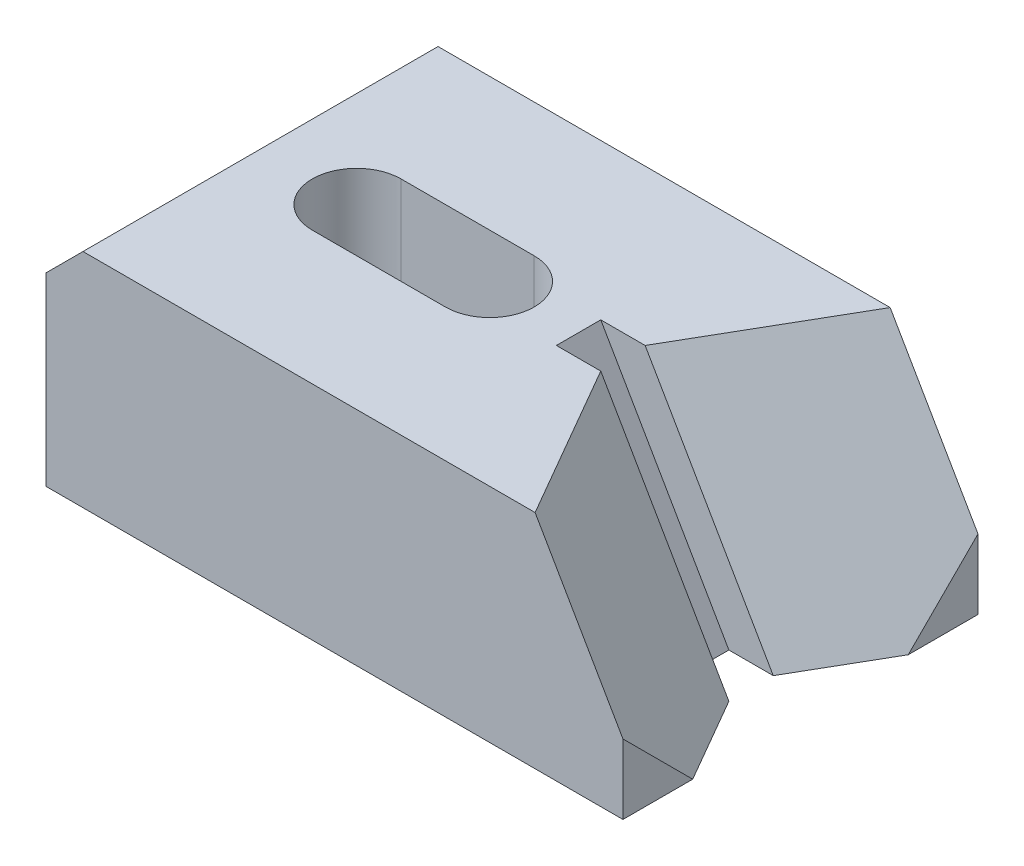
ISO-10303-21;
HEADER;
FILE_DESCRIPTION(('STEP AP214'),'2;1');
FILE_NAME('part.step','',(''),(''),'','','');
FILE_SCHEMA(('AUTOMOTIVE_DESIGN { 1 0 10303 214 1 1 1 1 }'));
ENDSEC;
DATA;
#1=APPLICATION_CONTEXT('core data for automotive mechanical design processes');
#2=APPLICATION_PROTOCOL_DEFINITION('international standard','automotive_design',2000,#1);
#3=PRODUCT_CONTEXT('',#1,'mechanical');
#4=PRODUCT('Part','Part','',(#3));
#5=PRODUCT_RELATED_PRODUCT_CATEGORY('part','',(#4));
#6=PRODUCT_DEFINITION_FORMATION('','',#4);
#7=PRODUCT_DEFINITION_CONTEXT('part definition',#1,'design');
#8=PRODUCT_DEFINITION('design','',#6,#7);
#9=PRODUCT_DEFINITION_SHAPE('','',#8);
#10=(LENGTH_UNIT() NAMED_UNIT(*) SI_UNIT(.MILLI.,.METRE.));
#11=(NAMED_UNIT(*) PLANE_ANGLE_UNIT() SI_UNIT($,.RADIAN.));
#12=(NAMED_UNIT(*) SI_UNIT($,.STERADIAN.) SOLID_ANGLE_UNIT());
#13=UNCERTAINTY_MEASURE_WITH_UNIT(LENGTH_MEASURE(1.E-05),#10,'distance_accuracy_value','');
#14=(GEOMETRIC_REPRESENTATION_CONTEXT(3) GLOBAL_UNCERTAINTY_ASSIGNED_CONTEXT((#13)) GLOBAL_UNIT_ASSIGNED_CONTEXT((#10,
#11,#12)) REPRESENTATION_CONTEXT('',''));
#15=CARTESIAN_POINT('',(0.,0.,0.));
#16=DIRECTION('',(0.,0.,1.));
#17=DIRECTION('',(1.,0.,0.));
#18=AXIS2_PLACEMENT_3D('',#15,#16,#17);
#19=CARTESIAN_POINT('',(78.,30.,-24.));
#20=DIRECTION('',(-1.,0.,0.));
#21=DIRECTION('',(0.,0.,1.));
#22=AXIS2_PLACEMENT_3D('',#19,#20,#21);
#23=PLANE('',#22);
#24=DIRECTION('',(0.,0.,-1.));
#25=VECTOR('',#24,1.);
#26=CARTESIAN_POINT('',(78.,0.,-24.));
#27=LINE('',#26,#25);
#28=CARTESIAN_POINT('',(78.,0.,24.));
#29=VERTEX_POINT('',#28);
#30=CARTESIAN_POINT('',(78.,0.,14.5692193816528));
#31=VERTEX_POINT('',#30);
#32=EDGE_CURVE('E204',#29,#31,#27,.T.);
#33=ORIENTED_EDGE('',*,*,#32,.T.);
#34=DIRECTION('',(0.,0.707106781186541,0.707106781186554));
#35=VECTOR('',#34,1.);
#36=CARTESIAN_POINT('',(78.,-4.28460969082667,10.2846096908261));
#37=LINE('',#36,#35);
#38=CARTESIAN_POINT('',(78.,9.43078061834703,24.));
#39=VERTEX_POINT('',#38);
#40=EDGE_CURVE('E275',#31,#39,#37,.T.);
#41=ORIENTED_EDGE('',*,*,#40,.T.);
#42=DIRECTION('',(0.,-1.,0.));
#43=VECTOR('',#42,1.);
#44=CARTESIAN_POINT('',(78.,30.,24.));
#45=LINE('',#44,#43);
#46=EDGE_CURVE('E213',#39,#29,#45,.T.);
#47=ORIENTED_EDGE('',*,*,#46,.T.);
#48=EDGE_LOOP('',(#33,#41,#47));
#49=FACE_BOUND('',#48,.T.);
#50=ADVANCED_FACE('F43',(#49),#23,.F.);
#51=CARTESIAN_POINT('',(0.,30.,-24.));
#52=DIRECTION('',(1.,0.,0.));
#53=DIRECTION('',(0.,0.,-1.));
#54=AXIS2_PLACEMENT_3D('',#51,#52,#53);
#55=PLANE('',#54);
#56=DIRECTION('',(0.,-1.,0.));
#57=VECTOR('',#56,1.);
#58=CARTESIAN_POINT('',(0.,30.,24.));
#59=LINE('',#58,#57);
#60=CARTESIAN_POINT('',(0.,25.,24.));
#61=VERTEX_POINT('',#60);
#62=CARTESIAN_POINT('',(0.,0.,24.));
#63=VERTEX_POINT('',#62);
#64=EDGE_CURVE('E216',#61,#63,#59,.T.);
#65=ORIENTED_EDGE('',*,*,#64,.F.);
#66=DIRECTION('',(0.,0.,-1.));
#67=VECTOR('',#66,1.);
#68=CARTESIAN_POINT('',(0.,25.,-24.));
#69=LINE('',#68,#67);
#70=CARTESIAN_POINT('',(0.,25.,-24.));
#71=VERTEX_POINT('',#70);
#72=EDGE_CURVE('E225',#61,#71,#69,.T.);
#73=ORIENTED_EDGE('',*,*,#72,.T.);
#74=DIRECTION('',(0.,-1.,0.));
#75=VECTOR('',#74,1.);
#76=CARTESIAN_POINT('',(0.,30.,-24.));
#77=LINE('',#76,#75);
#78=CARTESIAN_POINT('',(0.,0.,-24.));
#79=VERTEX_POINT('',#78);
#80=EDGE_CURVE('E181',#71,#79,#77,.T.);
#81=ORIENTED_EDGE('',*,*,#80,.T.);
#82=DIRECTION('',(0.,0.,1.));
#83=VECTOR('',#82,1.);
#84=CARTESIAN_POINT('',(0.,0.,-24.));
#85=LINE('',#84,#83);
#86=EDGE_CURVE('E194',#79,#63,#85,.T.);
#87=ORIENTED_EDGE('',*,*,#86,.T.);
#88=EDGE_LOOP('',(#65,#73,#81,#87));
#89=FACE_BOUND('',#88,.T.);
#90=ADVANCED_FACE('F344',(#89),#55,.F.);
#91=CARTESIAN_POINT('',(0.,30.,24.));
#92=DIRECTION('',(0.,0.,-1.));
#93=DIRECTION('',(-1.,0.,0.));
#94=AXIS2_PLACEMENT_3D('',#91,#92,#93);
#95=PLANE('',#94);
#96=ORIENTED_EDGE('',*,*,#46,.F.);
#97=DIRECTION('',(-0.500000000000004,0.866025403784436,0.));
#98=VECTOR('',#97,1.);
#99=CARTESIAN_POINT('',(86.6147367097489,-5.49038105676652,24.));
#100=LINE('',#99,#98);
#101=CARTESIAN_POINT('',(66.1243556529821,30.,24.));
#102=VERTEX_POINT('',#101);
#103=EDGE_CURVE('E266',#39,#102,#100,.T.);
#104=ORIENTED_EDGE('',*,*,#103,.T.);
#105=DIRECTION('',(1.,0.,0.));
#106=VECTOR('',#105,1.);
#107=CARTESIAN_POINT('',(0.,30.,24.));
#108=LINE('',#107,#106);
#109=CARTESIAN_POINT('',(5.,30.,24.));
#110=VERTEX_POINT('',#109);
#111=EDGE_CURVE('E182',#110,#102,#108,.T.);
#112=ORIENTED_EDGE('',*,*,#111,.F.);
#113=DIRECTION('',(-0.707106781186547,-0.707106781186549,0.));
#114=VECTOR('',#113,1.);
#115=CARTESIAN_POINT('',(5.,30.,24.));
#116=LINE('',#115,#114);
#117=EDGE_CURVE('E222',#110,#61,#116,.T.);
#118=ORIENTED_EDGE('',*,*,#117,.T.);
#119=ORIENTED_EDGE('',*,*,#64,.T.);
#120=DIRECTION('',(1.,0.,0.));
#121=VECTOR('',#120,1.);
#122=CARTESIAN_POINT('',(0.,0.,24.));
#123=LINE('',#122,#121);
#124=EDGE_CURVE('E198',#63,#29,#123,.T.);
#125=ORIENTED_EDGE('',*,*,#124,.T.);
#126=EDGE_LOOP('',(#96,#104,#112,#118,#119,#125));
#127=FACE_BOUND('',#126,.T.);
#128=ADVANCED_FACE('F353',(#127),#95,.F.);
#129=DIRECTION('',(0.,-1.,0.));
#130=VECTOR('',#129,1.);
#131=CARTESIAN_POINT('',(78.,30.,-24.));
#132=LINE('',#131,#130);
#133=CARTESIAN_POINT('',(78.,9.43078061834705,-24.));
#134=VERTEX_POINT('',#133);
#135=CARTESIAN_POINT('',(78.,0.,-24.));
#136=VERTEX_POINT('',#135);
#137=EDGE_CURVE('E187',#134,#136,#132,.T.);
#138=ORIENTED_EDGE('',*,*,#137,.F.);
#139=DIRECTION('',(0.,-0.707106781186542,0.707106781186553));
#140=VECTOR('',#139,1.);
#141=CARTESIAN_POINT('',(78.,19.7153903091734,-34.2846096908265));
#142=LINE('',#141,#140);
#143=CARTESIAN_POINT('',(78.,0.,-14.5692193816528));
#144=VERTEX_POINT('',#143);
#145=EDGE_CURVE('E156',#134,#144,#142,.T.);
#146=ORIENTED_EDGE('',*,*,#145,.T.);
#147=EDGE_CURVE('E203',#144,#136,#27,.T.);
#148=ORIENTED_EDGE('',*,*,#147,.T.);
#149=EDGE_LOOP('',(#138,#146,#148));
#150=FACE_BOUND('',#149,.T.);
#151=ADVANCED_FACE('F347',(#150),#23,.F.);
#152=CARTESIAN_POINT('',(0.,30.,-24.));
#153=DIRECTION('',(0.,0.,1.));
#154=DIRECTION('',(1.,0.,0.));
#155=AXIS2_PLACEMENT_3D('',#152,#153,#154);
#156=PLANE('',#155);
#157=DIRECTION('',(-1.,0.,0.));
#158=VECTOR('',#157,1.);
#159=CARTESIAN_POINT('',(0.,30.,-24.));
#160=LINE('',#159,#158);
#161=CARTESIAN_POINT('',(66.1243556529821,30.,-24.));
#162=VERTEX_POINT('',#161);
#163=CARTESIAN_POINT('',(4.99999999999998,30.,-24.));
#164=VERTEX_POINT('',#163);
#165=EDGE_CURVE('E168',#162,#164,#160,.T.);
#166=ORIENTED_EDGE('',*,*,#165,.F.);
#167=DIRECTION('',(-0.500000000000004,0.866025403784436,0.));
#168=VECTOR('',#167,1.);
#169=CARTESIAN_POINT('',(86.6147367097489,-5.49038105676652,-24.));
#170=LINE('',#169,#168);
#171=EDGE_CURVE('E150',#134,#162,#170,.T.);
#172=ORIENTED_EDGE('',*,*,#171,.F.);
#173=ORIENTED_EDGE('',*,*,#137,.T.);
#174=DIRECTION('',(-1.,0.,0.));
#175=VECTOR('',#174,1.);
#176=CARTESIAN_POINT('',(0.,0.,-24.));
#177=LINE('',#176,#175);
#178=EDGE_CURVE('E190',#136,#79,#177,.T.);
#179=ORIENTED_EDGE('',*,*,#178,.T.);
#180=ORIENTED_EDGE('',*,*,#80,.F.);
#181=DIRECTION('',(0.707106781186547,0.707106781186549,0.));
#182=VECTOR('',#181,1.);
#183=CARTESIAN_POINT('',(4.99999999999999,30.,-24.));
#184=LINE('',#183,#182);
#185=EDGE_CURVE('E178',#71,#164,#184,.T.);
#186=ORIENTED_EDGE('',*,*,#185,.T.);
#187=EDGE_LOOP('',(#166,#172,#173,#179,#180,#186));
#188=FACE_BOUND('',#187,.T.);
#189=ADVANCED_FACE('F175',(#188),#156,.F.);
#190=CARTESIAN_POINT('',(0.,30.,0.));
#191=DIRECTION('',(0.,1.,0.));
#192=DIRECTION('',(0.,0.,1.));
#193=AXIS2_PLACEMENT_3D('',#190,#191,#192);
#194=PLANE('',#193);
#195=DIRECTION('',(0.499999999999998,0.,0.86602540378444));
#196=VECTOR('',#195,1.);
#197=CARTESIAN_POINT('',(66.1243556529821,30.,24.));
#198=LINE('',#197,#196);
#199=CARTESIAN_POINT('',(54.,30.,3.));
#200=VERTEX_POINT('',#199);
#201=EDGE_CURVE('E161',#200,#102,#198,.T.);
#202=ORIENTED_EDGE('',*,*,#201,.F.);
#203=DIRECTION('',(1.,0.,0.));
#204=VECTOR('',#203,1.);
#205=CARTESIAN_POINT('',(54.,30.,3.));
#206=LINE('',#205,#204);
#207=CARTESIAN_POINT('',(48.,30.,3.));
#208=VERTEX_POINT('',#207);
#209=EDGE_CURVE('E380',#208,#200,#206,.T.);
#210=ORIENTED_EDGE('',*,*,#209,.F.);
#211=DIRECTION('',(0.,0.,1.));
#212=VECTOR('',#211,1.);
#213=CARTESIAN_POINT('',(48.,30.,-3.));
#214=LINE('',#213,#212);
#215=CARTESIAN_POINT('',(48.,30.,-3.));
#216=VERTEX_POINT('',#215);
#217=EDGE_CURVE('E258',#216,#208,#214,.T.);
#218=ORIENTED_EDGE('',*,*,#217,.F.);
#219=DIRECTION('',(-1.,0.,0.));
#220=VECTOR('',#219,1.);
#221=CARTESIAN_POINT('',(54.,30.,-3.));
#222=LINE('',#221,#220);
#223=CARTESIAN_POINT('',(54.,30.,-3.));
#224=VERTEX_POINT('',#223);
#225=EDGE_CURVE('E172',#224,#216,#222,.T.);
#226=ORIENTED_EDGE('',*,*,#225,.F.);
#227=DIRECTION('',(-0.499999999999998,0.,0.86602540378444));
#228=VECTOR('',#227,1.);
#229=CARTESIAN_POINT('',(66.1243556529821,30.,-24.));
#230=LINE('',#229,#228);
#231=EDGE_CURVE('E153',#162,#224,#230,.T.);
#232=ORIENTED_EDGE('',*,*,#231,.F.);
#233=ORIENTED_EDGE('',*,*,#165,.T.);
#234=DIRECTION('',(0.,0.,1.));
#235=VECTOR('',#234,1.);
#236=CARTESIAN_POINT('',(5.,30.,24.));
#237=LINE('',#236,#235);
#238=EDGE_CURVE('E219',#164,#110,#237,.T.);
#239=ORIENTED_EDGE('',*,*,#238,.T.);
#240=ORIENTED_EDGE('',*,*,#111,.T.);
#241=EDGE_LOOP('',(#202,#210,#218,#226,#232,#233,#239,#240));
#242=FACE_BOUND('',#241,.T.);
#243=CARTESIAN_POINT('',(18.,30.,0.));
#244=DIRECTION('',(0.,1.,0.));
#245=DIRECTION('',(0.,0.,1.));
#246=AXIS2_PLACEMENT_3D('',#243,#244,#245);
#247=CIRCLE('',#246,6.);
#248=CARTESIAN_POINT('',(18.,30.,-6.));
#249=VERTEX_POINT('',#248);
#250=CARTESIAN_POINT('',(18.,30.,6.));
#251=VERTEX_POINT('',#250);
#252=EDGE_CURVE('E68',#249,#251,#247,.T.);
#253=ORIENTED_EDGE('',*,*,#252,.F.);
#254=DIRECTION('',(-1.,0.,0.));
#255=VECTOR('',#254,1.);
#256=CARTESIAN_POINT('',(18.,30.,-6.));
#257=LINE('',#256,#255);
#258=CARTESIAN_POINT('',(36.,30.,-6.));
#259=VERTEX_POINT('',#258);
#260=EDGE_CURVE('E284',#259,#249,#257,.T.);
#261=ORIENTED_EDGE('',*,*,#260,.F.);
#262=CARTESIAN_POINT('',(36.,30.,0.));
#263=DIRECTION('',(0.,1.,0.));
#264=DIRECTION('',(0.,0.,1.));
#265=AXIS2_PLACEMENT_3D('',#262,#263,#264);
#266=CIRCLE('',#265,6.);
#267=CARTESIAN_POINT('',(36.,30.,6.));
#268=VERTEX_POINT('',#267);
#269=EDGE_CURVE('E303',#268,#259,#266,.T.);
#270=ORIENTED_EDGE('',*,*,#269,.F.);
#271=DIRECTION('',(1.,0.,0.));
#272=VECTOR('',#271,1.);
#273=CARTESIAN_POINT('',(18.,30.,6.));
#274=LINE('',#273,#272);
#275=EDGE_CURVE('E299',#251,#268,#274,.T.);
#276=ORIENTED_EDGE('',*,*,#275,.F.);
#277=EDGE_LOOP('',(#253,#261,#270,#276));
#278=FACE_BOUND('',#277,.T.);
#279=ADVANCED_FACE('F165',(#242,#278),#194,.T.);
#280=CARTESIAN_POINT('',(0.,0.,0.));
#281=DIRECTION('',(0.,1.,0.));
#282=DIRECTION('',(0.,0.,1.));
#283=AXIS2_PLACEMENT_3D('',#280,#281,#282);
#284=PLANE('',#283);
#285=DIRECTION('',(-1.,0.,0.));
#286=VECTOR('',#285,1.);
#287=CARTESIAN_POINT('',(18.,0.,-6.));
#288=LINE('',#287,#286);
#289=CARTESIAN_POINT('',(36.,0.,-6.));
#290=VERTEX_POINT('',#289);
#291=CARTESIAN_POINT('',(18.,0.,-6.));
#292=VERTEX_POINT('',#291);
#293=EDGE_CURVE('E292',#290,#292,#288,.T.);
#294=ORIENTED_EDGE('',*,*,#293,.T.);
#295=CARTESIAN_POINT('',(18.,0.,0.));
#296=DIRECTION('',(0.,1.,0.));
#297=DIRECTION('',(0.,0.,1.));
#298=AXIS2_PLACEMENT_3D('',#295,#296,#297);
#299=CIRCLE('',#298,6.);
#300=CARTESIAN_POINT('',(18.,0.,6.));
#301=VERTEX_POINT('',#300);
#302=EDGE_CURVE('E279',#292,#301,#299,.T.);
#303=ORIENTED_EDGE('',*,*,#302,.T.);
#304=DIRECTION('',(1.,0.,0.));
#305=VECTOR('',#304,1.);
#306=CARTESIAN_POINT('',(18.,0.,6.));
#307=LINE('',#306,#305);
#308=CARTESIAN_POINT('',(36.,0.,6.));
#309=VERTEX_POINT('',#308);
#310=EDGE_CURVE('E283',#301,#309,#307,.T.);
#311=ORIENTED_EDGE('',*,*,#310,.T.);
#312=CARTESIAN_POINT('',(36.,0.,0.));
#313=DIRECTION('',(0.,1.,0.));
#314=DIRECTION('',(0.,0.,1.));
#315=AXIS2_PLACEMENT_3D('',#312,#313,#314);
#316=CIRCLE('',#315,6.);
#317=EDGE_CURVE('E288',#309,#290,#316,.T.);
#318=ORIENTED_EDGE('',*,*,#317,.T.);
#319=EDGE_LOOP('',(#294,#303,#311,#318));
#320=FACE_BOUND('',#319,.T.);
#321=DIRECTION('',(1.,0.,0.));
#322=VECTOR('',#321,1.);
#323=CARTESIAN_POINT('',(0.,0.,2.99999999999999));
#324=LINE('',#323,#322);
#325=CARTESIAN_POINT('',(65.320508075689,0.,3.));
#326=VERTEX_POINT('',#325);
#327=CARTESIAN_POINT('',(71.320508075689,0.,3.));
#328=VERTEX_POINT('',#327);
#329=EDGE_CURVE('E53',#326,#328,#324,.T.);
#330=ORIENTED_EDGE('',*,*,#329,.T.);
#331=DIRECTION('',(0.499999999999998,0.,0.86602540378444));
#332=VECTOR('',#331,1.);
#333=CARTESIAN_POINT('',(52.1913429510902,0.,-30.1326859021798));
#334=LINE('',#333,#332);
#335=EDGE_CURVE('E11',#328,#31,#334,.T.);
#336=ORIENTED_EDGE('',*,*,#335,.T.);
#337=ORIENTED_EDGE('',*,*,#32,.F.);
#338=ORIENTED_EDGE('',*,*,#124,.F.);
#339=ORIENTED_EDGE('',*,*,#86,.F.);
#340=ORIENTED_EDGE('',*,*,#178,.F.);
#341=ORIENTED_EDGE('',*,*,#147,.F.);
#342=DIRECTION('',(-0.499999999999998,0.,0.86602540378444));
#343=VECTOR('',#342,1.);
#344=CARTESIAN_POINT('',(52.1913429510902,0.,30.1326859021798));
#345=LINE('',#344,#343);
#346=CARTESIAN_POINT('',(71.320508075689,0.,-3.));
#347=VERTEX_POINT('',#346);
#348=EDGE_CURVE('E230',#144,#347,#345,.T.);
#349=ORIENTED_EDGE('',*,*,#348,.T.);
#350=DIRECTION('',(-1.,0.,0.));
#351=VECTOR('',#350,1.);
#352=CARTESIAN_POINT('',(0.,0.,-2.99999999999999));
#353=LINE('',#352,#351);
#354=CARTESIAN_POINT('',(65.320508075689,0.,-3.));
#355=VERTEX_POINT('',#354);
#356=EDGE_CURVE('E234',#347,#355,#353,.T.);
#357=ORIENTED_EDGE('',*,*,#356,.T.);
#358=DIRECTION('',(0.,0.,1.));
#359=VECTOR('',#358,1.);
#360=CARTESIAN_POINT('',(65.320508075689,0.,0.));
#361=LINE('',#360,#359);
#362=EDGE_CURVE('E238',#355,#326,#361,.T.);
#363=ORIENTED_EDGE('',*,*,#362,.T.);
#364=EDGE_LOOP('',(#330,#336,#337,#338,#339,#340,#341,#349,#357,#363));
#365=FACE_BOUND('',#364,.T.);
#366=ADVANCED_FACE('F245',(#320,#365),#284,.F.);
#367=CARTESIAN_POINT('',(4.99999999999999,30.,0.));
#368=DIRECTION('',(-0.707106781186548,0.707106781186546,0.));
#369=DIRECTION('',(0.,0.,-1.));
#370=AXIS2_PLACEMENT_3D('',#367,#368,#369);
#371=PLANE('',#370);
#372=ORIENTED_EDGE('',*,*,#185,.F.);
#373=ORIENTED_EDGE('',*,*,#72,.F.);
#374=ORIENTED_EDGE('',*,*,#117,.F.);
#375=ORIENTED_EDGE('',*,*,#238,.F.);
#376=EDGE_LOOP('',(#372,#373,#374,#375));
#377=FACE_BOUND('',#376,.T.);
#378=ADVANCED_FACE('F46',(#377),#371,.T.);
#379=CARTESIAN_POINT('',(18.,0.,0.));
#380=DIRECTION('',(0.,1.,0.));
#381=DIRECTION('',(0.,0.,1.));
#382=AXIS2_PLACEMENT_3D('',#379,#380,#381);
#383=CYLINDRICAL_SURFACE('',#382,6.);
#384=ORIENTED_EDGE('',*,*,#252,.T.);
#385=DIRECTION('',(0.,1.,0.));
#386=VECTOR('',#385,1.);
#387=CARTESIAN_POINT('',(18.,0.,6.));
#388=LINE('',#387,#386);
#389=EDGE_CURVE('E296',#301,#251,#388,.T.);
#390=ORIENTED_EDGE('',*,*,#389,.F.);
#391=ORIENTED_EDGE('',*,*,#302,.F.);
#392=DIRECTION('',(0.,1.,0.));
#393=VECTOR('',#392,1.);
#394=CARTESIAN_POINT('',(18.,0.,-6.));
#395=LINE('',#394,#393);
#396=EDGE_CURVE('E199',#292,#249,#395,.T.);
#397=ORIENTED_EDGE('',*,*,#396,.T.);
#398=EDGE_LOOP('',(#384,#390,#391,#397));
#399=FACE_BOUND('',#398,.T.);
#400=ADVANCED_FACE('F331',(#399),#383,.F.);
#401=CARTESIAN_POINT('',(18.,0.,-6.));
#402=DIRECTION('',(0.,0.,-1.));
#403=DIRECTION('',(-1.,0.,0.));
#404=AXIS2_PLACEMENT_3D('',#401,#402,#403);
#405=PLANE('',#404);
#406=ORIENTED_EDGE('',*,*,#260,.T.);
#407=ORIENTED_EDGE('',*,*,#396,.F.);
#408=ORIENTED_EDGE('',*,*,#293,.F.);
#409=DIRECTION('',(0.,1.,0.));
#410=VECTOR('',#409,1.);
#411=CARTESIAN_POINT('',(36.,0.,-6.));
#412=LINE('',#411,#410);
#413=EDGE_CURVE('E312',#290,#259,#412,.T.);
#414=ORIENTED_EDGE('',*,*,#413,.T.);
#415=EDGE_LOOP('',(#406,#407,#408,#414));
#416=FACE_BOUND('',#415,.T.);
#417=ADVANCED_FACE('F333',(#416),#405,.F.);
#418=CARTESIAN_POINT('',(36.,0.,0.));
#419=DIRECTION('',(0.,1.,0.));
#420=DIRECTION('',(0.,0.,1.));
#421=AXIS2_PLACEMENT_3D('',#418,#419,#420);
#422=CYLINDRICAL_SURFACE('',#421,6.);
#423=ORIENTED_EDGE('',*,*,#269,.T.);
#424=ORIENTED_EDGE('',*,*,#413,.F.);
#425=ORIENTED_EDGE('',*,*,#317,.F.);
#426=DIRECTION('',(0.,1.,0.));
#427=VECTOR('',#426,1.);
#428=CARTESIAN_POINT('',(36.,0.,6.));
#429=LINE('',#428,#427);
#430=EDGE_CURVE('E315',#309,#268,#429,.T.);
#431=ORIENTED_EDGE('',*,*,#430,.T.);
#432=EDGE_LOOP('',(#423,#424,#425,#431));
#433=FACE_BOUND('',#432,.T.);
#434=ADVANCED_FACE('F328',(#433),#422,.F.);
#435=CARTESIAN_POINT('',(18.,0.,6.));
#436=DIRECTION('',(0.,0.,1.));
#437=DIRECTION('',(1.,0.,0.));
#438=AXIS2_PLACEMENT_3D('',#435,#436,#437);
#439=PLANE('',#438);
#440=ORIENTED_EDGE('',*,*,#275,.T.);
#441=ORIENTED_EDGE('',*,*,#430,.F.);
#442=ORIENTED_EDGE('',*,*,#310,.F.);
#443=ORIENTED_EDGE('',*,*,#389,.T.);
#444=EDGE_LOOP('',(#440,#441,#442,#443));
#445=FACE_BOUND('',#444,.T.);
#446=ADVANCED_FACE('F322',(#445),#439,.F.);
#447=CARTESIAN_POINT('',(86.6147367097489,-5.49038105676652,24.));
#448=DIRECTION('',(-0.774596669241482,-0.447213595499963,0.447213595499955));
#449=DIRECTION('',(0.500000000000004,-0.866025403784436,0.));
#450=AXIS2_PLACEMENT_3D('',#447,#448,#449);
#451=PLANE('',#450);
#452=ORIENTED_EDGE('',*,*,#335,.F.);
#453=DIRECTION('',(-0.500000000000004,0.866025403784436,0.));
#454=VECTOR('',#453,1.);
#455=CARTESIAN_POINT('',(74.4903810567668,-5.49038105676652,3.));
#456=LINE('',#455,#454);
#457=EDGE_CURVE('E254',#328,#200,#456,.T.);
#458=ORIENTED_EDGE('',*,*,#457,.T.);
#459=ORIENTED_EDGE('',*,*,#201,.T.);
#460=ORIENTED_EDGE('',*,*,#103,.F.);
#461=ORIENTED_EDGE('',*,*,#40,.F.);
#462=EDGE_LOOP('',(#452,#458,#459,#460,#461));
#463=FACE_BOUND('',#462,.T.);
#464=ADVANCED_FACE('F389',(#463),#451,.F.);
#465=CARTESIAN_POINT('',(74.4903810567668,-5.49038105676652,3.));
#466=DIRECTION('',(0.,0.,1.));
#467=DIRECTION('',(1.,0.,0.));
#468=AXIS2_PLACEMENT_3D('',#465,#466,#467);
#469=PLANE('',#468);
#470=DIRECTION('',(-0.500000000000004,0.866025403784436,0.));
#471=VECTOR('',#470,1.);
#472=CARTESIAN_POINT('',(68.4903810567668,-5.49038105676652,3.));
#473=LINE('',#472,#471);
#474=EDGE_CURVE('E252',#326,#208,#473,.T.);
#475=ORIENTED_EDGE('',*,*,#474,.T.);
#476=ORIENTED_EDGE('',*,*,#209,.T.);
#477=ORIENTED_EDGE('',*,*,#457,.F.);
#478=ORIENTED_EDGE('',*,*,#329,.F.);
#479=EDGE_LOOP('',(#475,#476,#477,#478));
#480=FACE_BOUND('',#479,.T.);
#481=ADVANCED_FACE('F250',(#480),#469,.F.);
#482=CARTESIAN_POINT('',(68.4903810567668,-5.49038105676652,-3.));
#483=DIRECTION('',(-0.866025403784436,-0.500000000000004,0.));
#484=DIRECTION('',(0.500000000000004,-0.866025403784436,0.));
#485=AXIS2_PLACEMENT_3D('',#482,#483,#484);
#486=PLANE('',#485);
#487=DIRECTION('',(-0.500000000000004,0.866025403784436,0.));
#488=VECTOR('',#487,1.);
#489=CARTESIAN_POINT('',(68.4903810567668,-5.49038105676652,-3.));
#490=LINE('',#489,#488);
#491=EDGE_CURVE('E261',#355,#216,#490,.T.);
#492=ORIENTED_EDGE('',*,*,#491,.T.);
#493=ORIENTED_EDGE('',*,*,#217,.T.);
#494=ORIENTED_EDGE('',*,*,#474,.F.);
#495=ORIENTED_EDGE('',*,*,#362,.F.);
#496=EDGE_LOOP('',(#492,#493,#494,#495));
#497=FACE_BOUND('',#496,.T.);
#498=ADVANCED_FACE('F256',(#497),#486,.F.);
#499=CARTESIAN_POINT('',(74.4903810567668,-5.49038105676652,-3.));
#500=DIRECTION('',(0.,0.,-1.));
#501=DIRECTION('',(-1.,0.,0.));
#502=AXIS2_PLACEMENT_3D('',#499,#500,#501);
#503=PLANE('',#502);
#504=DIRECTION('',(-0.500000000000004,0.866025403784436,0.));
#505=VECTOR('',#504,1.);
#506=CARTESIAN_POINT('',(74.4903810567668,-5.49038105676652,-3.));
#507=LINE('',#506,#505);
#508=EDGE_CURVE('E60',#347,#224,#507,.T.);
#509=ORIENTED_EDGE('',*,*,#508,.T.);
#510=ORIENTED_EDGE('',*,*,#225,.T.);
#511=ORIENTED_EDGE('',*,*,#491,.F.);
#512=ORIENTED_EDGE('',*,*,#356,.F.);
#513=EDGE_LOOP('',(#509,#510,#511,#512));
#514=FACE_BOUND('',#513,.T.);
#515=ADVANCED_FACE('F388',(#514),#503,.F.);
#516=CARTESIAN_POINT('',(86.6147367097489,-5.49038105676652,-24.));
#517=DIRECTION('',(-0.774596669241482,-0.447213595499963,-0.447213595499955));
#518=DIRECTION('',(0.500000000000004,-0.866025403784436,0.));
#519=AXIS2_PLACEMENT_3D('',#516,#517,#518);
#520=PLANE('',#519);
#521=ORIENTED_EDGE('',*,*,#171,.T.);
#522=ORIENTED_EDGE('',*,*,#231,.T.);
#523=ORIENTED_EDGE('',*,*,#508,.F.);
#524=ORIENTED_EDGE('',*,*,#348,.F.);
#525=ORIENTED_EDGE('',*,*,#145,.F.);
#526=EDGE_LOOP('',(#521,#522,#523,#524,#525));
#527=FACE_BOUND('',#526,.T.);
#528=ADVANCED_FACE('F152',(#527),#520,.F.);
#529=CLOSED_SHELL('',(#50,#90,#128,#151,#189,#279,#366,#378,#400,#417,#434,#446,#464,#481,#498,
#515,#528));
#530=MANIFOLD_SOLID_BREP('B2',#529);
#531=ADVANCED_BREP_SHAPE_REPRESENTATION('',(#18,#530),#14);
#532=SHAPE_DEFINITION_REPRESENTATION(#9,#531);
ENDSEC;
END-ISO-10303-21;
